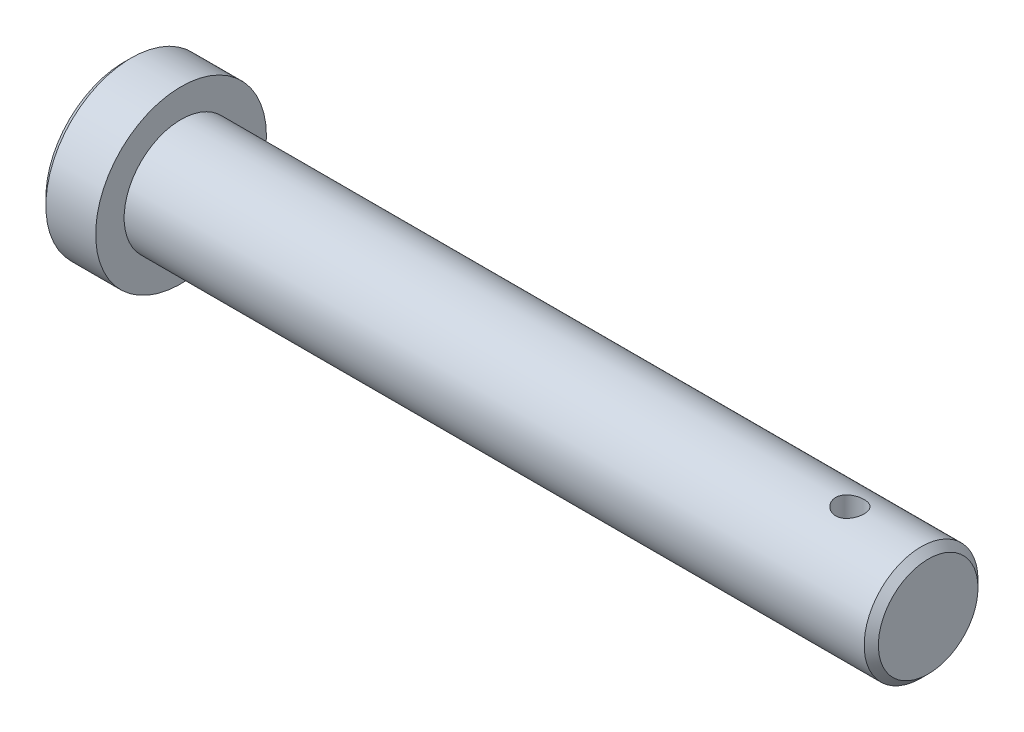
ISO-10303-21;
HEADER;
FILE_DESCRIPTION(('STEP AP214'),'2;1');
FILE_NAME('part.step','',(''),(''),'','','');
FILE_SCHEMA(('AUTOMOTIVE_DESIGN { 1 0 10303 214 1 1 1 1 }'));
ENDSEC;
DATA;
#1=APPLICATION_CONTEXT('core data for automotive mechanical design processes');
#2=APPLICATION_PROTOCOL_DEFINITION('international standard','automotive_design',2000,#1);
#3=PRODUCT_CONTEXT('',#1,'mechanical');
#4=PRODUCT('Part','Part','',(#3));
#5=PRODUCT_RELATED_PRODUCT_CATEGORY('part','',(#4));
#6=PRODUCT_DEFINITION_FORMATION('','',#4);
#7=PRODUCT_DEFINITION_CONTEXT('part definition',#1,'design');
#8=PRODUCT_DEFINITION('design','',#6,#7);
#9=PRODUCT_DEFINITION_SHAPE('','',#8);
#10=(LENGTH_UNIT() NAMED_UNIT(*) SI_UNIT(.MILLI.,.METRE.));
#11=(NAMED_UNIT(*) PLANE_ANGLE_UNIT() SI_UNIT($,.RADIAN.));
#12=(NAMED_UNIT(*) SI_UNIT($,.STERADIAN.) SOLID_ANGLE_UNIT());
#13=UNCERTAINTY_MEASURE_WITH_UNIT(LENGTH_MEASURE(1.E-05),#10,'distance_accuracy_value','');
#14=(GEOMETRIC_REPRESENTATION_CONTEXT(3) GLOBAL_UNCERTAINTY_ASSIGNED_CONTEXT((#13)) GLOBAL_UNIT_ASSIGNED_CONTEXT((#10,
#11,#12)) REPRESENTATION_CONTEXT('',''));
#15=CARTESIAN_POINT('',(0.,0.,0.));
#16=DIRECTION('',(0.,0.,1.));
#17=DIRECTION('',(1.,0.,0.));
#18=AXIS2_PLACEMENT_3D('',#15,#16,#17);
#19=CARTESIAN_POINT('',(8.,0.,0.));
#20=DIRECTION('',(-1.,0.,0.));
#21=DIRECTION('',(0.,0.,1.));
#22=AXIS2_PLACEMENT_3D('',#19,#20,#21);
#23=CYLINDRICAL_SURFACE('',#22,12.);
#24=CARTESIAN_POINT('',(1.,0.,0.));
#25=DIRECTION('',(1.,0.,0.));
#26=DIRECTION('',(0.,0.,-1.));
#27=AXIS2_PLACEMENT_3D('',#24,#25,#26);
#28=CIRCLE('',#27,12.);
#29=CARTESIAN_POINT('',(1.,0.,-12.));
#30=VERTEX_POINT('',#29);
#31=EDGE_CURVE('E111',#30,#30,#28,.T.);
#32=ORIENTED_EDGE('',*,*,#31,.T.);
#33=EDGE_LOOP('',(#32));
#34=FACE_BOUND('',#33,.T.);
#35=CARTESIAN_POINT('',(8.,0.,0.));
#36=DIRECTION('',(1.,0.,0.));
#37=DIRECTION('',(0.,0.,-1.));
#38=AXIS2_PLACEMENT_3D('',#35,#36,#37);
#39=CIRCLE('',#38,12.);
#40=CARTESIAN_POINT('',(8.,0.,-12.));
#41=VERTEX_POINT('',#40);
#42=EDGE_CURVE('E112',#41,#41,#39,.T.);
#43=ORIENTED_EDGE('',*,*,#42,.F.);
#44=EDGE_LOOP('',(#43));
#45=FACE_BOUND('',#44,.T.);
#46=ADVANCED_FACE('F39',(#34,#45),#23,.T.);
#47=CARTESIAN_POINT('',(8.,0.,0.));
#48=DIRECTION('',(1.,0.,0.));
#49=DIRECTION('',(0.,0.,-1.));
#50=AXIS2_PLACEMENT_3D('',#47,#48,#49);
#51=PLANE('',#50);
#52=CARTESIAN_POINT('',(8.,0.,0.));
#53=DIRECTION('',(1.,0.,0.));
#54=DIRECTION('',(0.,0.,-1.));
#55=AXIS2_PLACEMENT_3D('',#52,#53,#54);
#56=CIRCLE('',#55,8.);
#57=CARTESIAN_POINT('',(8.,0.,-8.));
#58=VERTEX_POINT('',#57);
#59=EDGE_CURVE('E58',#58,#58,#56,.T.);
#60=ORIENTED_EDGE('',*,*,#59,.F.);
#61=EDGE_LOOP('',(#60));
#62=FACE_BOUND('',#61,.T.);
#63=ORIENTED_EDGE('',*,*,#42,.T.);
#64=EDGE_LOOP('',(#63));
#65=FACE_BOUND('',#64,.T.);
#66=ADVANCED_FACE('F87',(#62,#65),#51,.T.);
#67=CARTESIAN_POINT('',(0.,0.,0.));
#68=DIRECTION('',(1.,0.,0.));
#69=DIRECTION('',(0.,0.,-1.));
#70=AXIS2_PLACEMENT_3D('',#67,#68,#69);
#71=PLANE('',#70);
#72=CARTESIAN_POINT('',(0.,0.,0.));
#73=DIRECTION('',(1.,0.,0.));
#74=DIRECTION('',(0.,0.,-1.));
#75=AXIS2_PLACEMENT_3D('',#72,#73,#74);
#76=CIRCLE('',#75,11.);
#77=CARTESIAN_POINT('',(0.,0.,-11.));
#78=VERTEX_POINT('',#77);
#79=EDGE_CURVE('E109',#78,#78,#76,.F.);
#80=ORIENTED_EDGE('',*,*,#79,.T.);
#81=EDGE_LOOP('',(#80));
#82=FACE_BOUND('',#81,.T.);
#83=ADVANCED_FACE('F93',(#82),#71,.F.);
#84=CARTESIAN_POINT('',(1.,0.,0.));
#85=DIRECTION('',(1.,0.,0.));
#86=DIRECTION('',(0.,0.,-1.));
#87=AXIS2_PLACEMENT_3D('',#84,#85,#86);
#88=CONICAL_SURFACE('',#87,12.,0.78539816339745);
#89=ORIENTED_EDGE('',*,*,#79,.F.);
#90=EDGE_LOOP('',(#89));
#91=FACE_BOUND('',#90,.T.);
#92=ORIENTED_EDGE('',*,*,#31,.F.);
#93=EDGE_LOOP('',(#92));
#94=FACE_BOUND('',#93,.T.);
#95=ADVANCED_FACE('F84',(#91,#94),#88,.T.);
#96=CARTESIAN_POINT('',(113.,0.,0.));
#97=DIRECTION('',(-1.,0.,0.));
#98=DIRECTION('',(0.,0.,1.));
#99=AXIS2_PLACEMENT_3D('',#96,#97,#98);
#100=CYLINDRICAL_SURFACE('',#99,8.);
#101=CARTESIAN_POINT('',(102.,-7.74596669241483,2.));
#102=CARTESIAN_POINT('',(102.110440600741,-7.74596880070288,1.99999686287445));
#103=CARTESIAN_POINT('',(102.220915918943,-7.74835444811678,1.99082099639812));
#104=CARTESIAN_POINT('',(102.438694062539,-7.75761489594051,1.95441850037103));
#105=CARTESIAN_POINT('',(102.545995003575,-7.76449230897304,1.92718136539368));
#106=CARTESIAN_POINT('',(102.75424283055,-7.7819097967692,1.85559295970563));
#107=CARTESIAN_POINT('',(102.855197724309,-7.79244514152366,1.81126378228359));
#108=CARTESIAN_POINT('',(103.048248682032,-7.81598553623007,1.70681691300911));
#109=CARTESIAN_POINT('',(103.140344369664,-7.82899069102791,1.64669855084855));
#110=CARTESIAN_POINT('',(103.31508931621,-7.856325730845,1.51096674184951));
#111=CARTESIAN_POINT('',(103.39751488028,-7.87067678098427,1.43506951016325));
#112=CARTESIAN_POINT('',(103.548609115488,-7.89890300412235,1.27054565128054));
#113=CARTESIAN_POINT('',(103.617276500497,-7.91277813253111,1.18191783534426));
#114=CARTESIAN_POINT('',(103.739820374105,-7.93872332416466,0.992916160863172));
#115=CARTESIAN_POINT('',(103.793477110529,-7.95076549920474,0.892395660956105));
#116=CARTESIAN_POINT('',(103.883047715322,-7.97144649540787,0.683410547434216));
#117=CARTESIAN_POINT('',(103.918964201532,-7.98008581867475,0.574947108633554));
#118=CARTESIAN_POINT('',(103.971318267663,-7.99283807078544,0.355487007003329));
#119=CARTESIAN_POINT('',(103.988135715461,-7.99703915075451,0.244586175639181));
#120=CARTESIAN_POINT('',(104.00300670342,-8.00074875285838,0.0214630554102188));
#121=CARTESIAN_POINT('',(104.001063017768,-8.00025796877363,-0.0907590356304507));
#122=CARTESIAN_POINT('',(103.9787401198,-7.99470475962828,-0.310704494344769));
#123=CARTESIAN_POINT('',(103.958770939957,-7.98974401872699,-0.418472431202127));
#124=CARTESIAN_POINT('',(103.901622983961,-7.97592669219883,-0.629076494827365));
#125=CARTESIAN_POINT('',(103.864443291698,-7.96706989918753,-0.73191235874087));
#126=CARTESIAN_POINT('',(103.77359794345,-7.94630007760716,-0.930813407003608));
#127=CARTESIAN_POINT('',(103.719786364271,-7.93436015756043,-1.026809019533));
#128=CARTESIAN_POINT('',(103.597315456707,-7.90871923047719,-1.20855124468097));
#129=CARTESIAN_POINT('',(103.528653545151,-7.89501791721992,-1.29429607017101));
#130=CARTESIAN_POINT('',(103.376233006414,-7.86690971015616,-1.4555480701699));
#131=CARTESIAN_POINT('',(103.292116086122,-7.85249375620734,-1.53071535815039));
#132=CARTESIAN_POINT('',(103.112320021168,-7.82492034813365,-1.66595275192603));
#133=CARTESIAN_POINT('',(103.016640336407,-7.81176295284777,-1.72602215209203));
#134=CARTESIAN_POINT('',(102.815767972681,-7.78816397465319,-1.82957625804519));
#135=CARTESIAN_POINT('',(102.710531415749,-7.77773586980577,-1.87297913394098));
#136=CARTESIAN_POINT('',(102.493931625539,-7.76094912111966,-1.94137124127268));
#137=CARTESIAN_POINT('',(102.382569708813,-7.75458960648175,-1.96636441310582));
#138=CARTESIAN_POINT('',(102.160032398781,-7.74684284831313,-1.99666371093214));
#139=CARTESIAN_POINT('',(102.048929765336,-7.74532871274919,-2.0024723791357));
#140=CARTESIAN_POINT('',(101.827342450737,-7.74709874784831,-1.99561359241243));
#141=CARTESIAN_POINT('',(101.716857713639,-7.75038247681013,-1.98294783827904));
#142=CARTESIAN_POINT('',(101.501508588036,-7.76125665563648,-1.93994037115013));
#143=CARTESIAN_POINT('',(101.396581818743,-7.768775761875,-1.90989125462539));
#144=CARTESIAN_POINT('',(101.193254833719,-7.7872057461677,-1.83329446533649));
#145=CARTESIAN_POINT('',(101.094855392756,-7.79811702598891,-1.78674483817003));
#146=CARTESIAN_POINT('',(100.905246977706,-7.8223690967461,-1.67741653434924));
#147=CARTESIAN_POINT('',(100.814216927966,-7.83575334885314,-1.61433740306849));
#148=CARTESIAN_POINT('',(100.643849309759,-7.86333666457373,-1.4741205858689));
#149=CARTESIAN_POINT('',(100.56451366668,-7.87753586182776,-1.39698058961087));
#150=CARTESIAN_POINT('',(100.417751165943,-7.90557922425285,-1.22852544196944));
#151=CARTESIAN_POINT('',(100.350671949961,-7.91940561649468,-1.13690390506318));
#152=CARTESIAN_POINT('',(100.232851306439,-7.94477773290987,-0.943405365389353));
#153=CARTESIAN_POINT('',(100.182109026713,-7.95632357603169,-0.841528897915187));
#154=CARTESIAN_POINT('',(100.098843172378,-7.9757609259065,-0.631116403462189));
#155=CARTESIAN_POINT('',(100.066188572497,-7.98367864017925,-0.522634762055773));
#156=CARTESIAN_POINT('',(100.019631732313,-7.99508234716634,-0.301499520637622));
#157=CARTESIAN_POINT('',(100.005725873009,-7.99856919514738,-0.188846730082488));
#158=CARTESIAN_POINT('',(99.9972648208489,-8.00068338817612,0.0341670528866387));
#159=CARTESIAN_POINT('',(100.002196581809,-7.99943957759977,0.144507653932035));
#160=CARTESIAN_POINT('',(100.030095654589,-7.99251792914887,0.362734992829493));
#161=CARTESIAN_POINT('',(100.053062430026,-7.98684022314338,0.470621803561851));
#162=CARTESIAN_POINT('',(100.116104439542,-7.97170865707778,0.680342071289543));
#163=CARTESIAN_POINT('',(100.156086906629,-7.96227529004785,0.782204989161721));
#164=CARTESIAN_POINT('',(100.251941158039,-7.94062577827316,0.977834106083244));
#165=CARTESIAN_POINT('',(100.307814945341,-7.92840928277515,1.07159928253126));
#166=CARTESIAN_POINT('',(100.435430467992,-7.90214499360574,1.2508038568466));
#167=CARTESIAN_POINT('',(100.507520285808,-7.88806033883329,1.33598997659666));
#168=CARTESIAN_POINT('',(100.664845703955,-7.8598129811438,1.493230040547));
#169=CARTESIAN_POINT('',(100.750084632222,-7.84565025934605,1.56528065015317));
#170=CARTESIAN_POINT('',(100.933202828379,-7.81854951691005,1.69552405294366));
#171=CARTESIAN_POINT('',(101.03128824673,-7.80563927346578,1.75343323883275));
#172=CARTESIAN_POINT('',(101.23611097975,-7.78287910989656,1.85185379317093));
#173=CARTESIAN_POINT('',(101.342841932188,-7.77302696466428,1.8923778195043));
#174=CARTESIAN_POINT('',(101.54115402367,-7.75903817501475,1.948845057142));
#175=CARTESIAN_POINT('',(101.631786328772,-7.75417326006998,1.96798634119375));
#176=CARTESIAN_POINT('',(101.814937737995,-7.7476367716524,1.99356458514353));
#177=CARTESIAN_POINT('',(101.907456680489,-7.74596492578216,2.0000026287435));
#178=CARTESIAN_POINT('',(102.,-7.74596669241483,2.));
#179=B_SPLINE_CURVE_WITH_KNOTS('',3,(#101,#102,#103,#104,#105,#106,#107,#108,#109,#110,#111,
#112,#113,#114,#115,#116,#117,#118,#119,#120,#121,#122,#123,#124,#125,#126,#127,#128,#129,#130,
#131,#132,#133,#134,#135,#136,#137,#138,#139,#140,#141,#142,#143,#144,#145,#146,#147,#148,#149,
#150,#151,#152,#153,#154,#155,#156,#157,#158,#159,#160,#161,#162,#163,#164,#165,#166,#167,#168,
#169,#170,#171,#172,#173,#174,#175,#176,#177,#178),.UNSPECIFIED.,.T.,.F.,(4,2,2,2,2,2,2,2,2,2,2,
2,2,2,2,2,2,2,2,2,2,2,2,2,2,2,2,2,2,2,2,2,2,2,2,2,2,2,4),(0.,0.330981953388902,
0.662156593142927,0.992904581732803,1.32366661404381,1.66099163354378,1.99834817183891,
2.34041197118335,2.68242527877673,3.01751000796276,3.35254518932815,3.68014610151156,
4.00776445379828,4.33834299403555,4.66897908375129,5.00856373257526,5.3481642495984,
5.6894114560672,6.03058560103637,6.36274859809372,6.69488101747039,7.02157924007365,
7.34831617137133,7.68146276687326,8.01466415108035,8.35620264772253,8.6977233257564,
9.03673658245541,9.37568439127228,9.70546756901963,10.0352409390158,10.3632390124777,
10.6912784459046,11.0271767726565,11.363160252524,11.7054118182895,12.0474137709605,
12.3247826174462,12.6021278008237),.UNSPECIFIED.);
#180=CARTESIAN_POINT('',(102.,-7.74596669241483,2.));
#181=VERTEX_POINT('',#180);
#182=EDGE_CURVE('E44',#181,#181,#179,.T.);
#183=ORIENTED_EDGE('',*,*,#182,.T.);
#184=EDGE_LOOP('',(#183));
#185=FACE_BOUND('',#184,.T.);
#186=CARTESIAN_POINT('',(102.,7.74596669241483,2.));
#187=CARTESIAN_POINT('',(101.889559399259,7.74596880070288,1.99999686287445));
#188=CARTESIAN_POINT('',(101.779084081057,7.74835444811678,1.99082099639812));
#189=CARTESIAN_POINT('',(101.561305937461,7.75761489594051,1.95441850037103));
#190=CARTESIAN_POINT('',(101.454004996425,7.76449230897304,1.92718136539368));
#191=CARTESIAN_POINT('',(101.24575716945,7.7819097967692,1.85559295970563));
#192=CARTESIAN_POINT('',(101.144802275691,7.79244514152366,1.81126378228359));
#193=CARTESIAN_POINT('',(100.951751317968,7.81598553623007,1.70681691300911));
#194=CARTESIAN_POINT('',(100.859655630336,7.82899069102791,1.64669855084855));
#195=CARTESIAN_POINT('',(100.68491068379,7.856325730845,1.51096674184951));
#196=CARTESIAN_POINT('',(100.60248511972,7.87067678098427,1.43506951016325));
#197=CARTESIAN_POINT('',(100.451390884512,7.89890300412235,1.27054565128054));
#198=CARTESIAN_POINT('',(100.382723499503,7.91277813253111,1.18191783534426));
#199=CARTESIAN_POINT('',(100.260179625895,7.93872332416466,0.992916160863172));
#200=CARTESIAN_POINT('',(100.206522889471,7.95076549920474,0.892395660956105));
#201=CARTESIAN_POINT('',(100.116952284678,7.97144649540787,0.683410547434216));
#202=CARTESIAN_POINT('',(100.081035798468,7.98008581867475,0.574947108633554));
#203=CARTESIAN_POINT('',(100.028681732337,7.99283807078544,0.355487007003329));
#204=CARTESIAN_POINT('',(100.011864284539,7.99703915075451,0.244586175639181));
#205=CARTESIAN_POINT('',(99.9969932965796,8.00074875285838,0.0214630554102188));
#206=CARTESIAN_POINT('',(99.9989369822323,8.00025796877363,-0.0907590356304507));
#207=CARTESIAN_POINT('',(100.0212598802,7.99470475962828,-0.310704494344769));
#208=CARTESIAN_POINT('',(100.041229060043,7.98974401872699,-0.418472431202127));
#209=CARTESIAN_POINT('',(100.098377016039,7.97592669219883,-0.629076494827365));
#210=CARTESIAN_POINT('',(100.135556708302,7.96706989918753,-0.73191235874087));
#211=CARTESIAN_POINT('',(100.22640205655,7.94630007760716,-0.930813407003608));
#212=CARTESIAN_POINT('',(100.280213635729,7.93436015756043,-1.026809019533));
#213=CARTESIAN_POINT('',(100.402684543293,7.90871923047719,-1.20855124468097));
#214=CARTESIAN_POINT('',(100.471346454849,7.89501791721992,-1.29429607017101));
#215=CARTESIAN_POINT('',(100.623766993586,7.86690971015616,-1.4555480701699));
#216=CARTESIAN_POINT('',(100.707883913878,7.85249375620734,-1.53071535815039));
#217=CARTESIAN_POINT('',(100.887679978832,7.82492034813365,-1.66595275192603));
#218=CARTESIAN_POINT('',(100.983359663593,7.81176295284777,-1.72602215209203));
#219=CARTESIAN_POINT('',(101.184232027319,7.78816397465319,-1.82957625804519));
#220=CARTESIAN_POINT('',(101.289468584251,7.77773586980577,-1.87297913394098));
#221=CARTESIAN_POINT('',(101.506068374461,7.76094912111966,-1.94137124127268));
#222=CARTESIAN_POINT('',(101.617430291186,7.75458960648175,-1.96636441310582));
#223=CARTESIAN_POINT('',(101.839967601218,7.74684284831313,-1.99666371093214));
#224=CARTESIAN_POINT('',(101.951070234664,7.74532871274919,-2.0024723791357));
#225=CARTESIAN_POINT('',(102.172657549263,7.74709874784831,-1.99561359241243));
#226=CARTESIAN_POINT('',(102.283142286361,7.75038247681013,-1.98294783827904));
#227=CARTESIAN_POINT('',(102.498491411964,7.76125665563648,-1.93994037115013));
#228=CARTESIAN_POINT('',(102.603418181257,7.768775761875,-1.9098912546254));
#229=CARTESIAN_POINT('',(102.806745166281,7.7872057461677,-1.8332944653365));
#230=CARTESIAN_POINT('',(102.905144607244,7.79811702598891,-1.78674483817003));
#231=CARTESIAN_POINT('',(103.094753022294,7.8223690967461,-1.67741653434924));
#232=CARTESIAN_POINT('',(103.185783072034,7.83575334885313,-1.6143374030685));
#233=CARTESIAN_POINT('',(103.356150690241,7.86333666457373,-1.4741205858689));
#234=CARTESIAN_POINT('',(103.43548633332,7.87753586182776,-1.39698058961087));
#235=CARTESIAN_POINT('',(103.582248834057,7.90557922425285,-1.22852544196944));
#236=CARTESIAN_POINT('',(103.649328050039,7.91940561649468,-1.13690390506318));
#237=CARTESIAN_POINT('',(103.767148693561,7.94477773290987,-0.943405365389353));
#238=CARTESIAN_POINT('',(103.817890973287,7.95632357603169,-0.841528897915187));
#239=CARTESIAN_POINT('',(103.901156827622,7.9757609259065,-0.631116403462189));
#240=CARTESIAN_POINT('',(103.933811427503,7.98367864017925,-0.522634762055773));
#241=CARTESIAN_POINT('',(103.980368267687,7.99508234716634,-0.301499520637622));
#242=CARTESIAN_POINT('',(103.994274126991,7.99856919514738,-0.188846730082488));
#243=CARTESIAN_POINT('',(104.002735179151,8.00068338817612,0.0341670528866387));
#244=CARTESIAN_POINT('',(103.997803418191,7.99943957759977,0.144507653932035));
#245=CARTESIAN_POINT('',(103.969904345411,7.99251792914887,0.362734992829493));
#246=CARTESIAN_POINT('',(103.946937569974,7.98684022314338,0.470621803561851));
#247=CARTESIAN_POINT('',(103.883895560458,7.97170865707778,0.680342071289542));
#248=CARTESIAN_POINT('',(103.843913093371,7.96227529004785,0.782204989161717));
#249=CARTESIAN_POINT('',(103.748058841961,7.94062577827316,0.977834106083241));
#250=CARTESIAN_POINT('',(103.692185054659,7.92840928277515,1.07159928253126));
#251=CARTESIAN_POINT('',(103.564569532008,7.90214499360574,1.2508038568466));
#252=CARTESIAN_POINT('',(103.492479714192,7.88806033883329,1.33598997659666));
#253=CARTESIAN_POINT('',(103.335154296045,7.8598129811438,1.493230040547));
#254=CARTESIAN_POINT('',(103.249915367778,7.84565025934605,1.56528065015317));
#255=CARTESIAN_POINT('',(103.066797171621,7.81854951691005,1.69552405294366));
#256=CARTESIAN_POINT('',(102.968711753269,7.80563927346578,1.75343323883275));
#257=CARTESIAN_POINT('',(102.76388902025,7.78287910989656,1.85185379317093));
#258=CARTESIAN_POINT('',(102.657158067812,7.77302696466428,1.8923778195043));
#259=CARTESIAN_POINT('',(102.45884597633,7.75903817501475,1.948845057142));
#260=CARTESIAN_POINT('',(102.368213671228,7.75417326006998,1.96798634119375));
#261=CARTESIAN_POINT('',(102.185062262005,7.7476367716524,1.99356458514353));
#262=CARTESIAN_POINT('',(102.092543319511,7.74596492578216,2.0000026287435));
#263=CARTESIAN_POINT('',(102.,7.74596669241483,2.));
#264=B_SPLINE_CURVE_WITH_KNOTS('',3,(#186,#187,#188,#189,#190,#191,#192,#193,#194,#195,#196,
#197,#198,#199,#200,#201,#202,#203,#204,#205,#206,#207,#208,#209,#210,#211,#212,#213,#214,#215,
#216,#217,#218,#219,#220,#221,#222,#223,#224,#225,#226,#227,#228,#229,#230,#231,#232,#233,#234,
#235,#236,#237,#238,#239,#240,#241,#242,#243,#244,#245,#246,#247,#248,#249,#250,#251,#252,#253,
#254,#255,#256,#257,#258,#259,#260,#261,#262,#263),.UNSPECIFIED.,.T.,.F.,(4,2,2,2,2,2,2,2,2,2,2,
2,2,2,2,2,2,2,2,2,2,2,2,2,2,2,2,2,2,2,2,2,2,2,2,2,2,2,4),(0.,0.330981953388917,
0.662156593142927,0.992904581732803,1.32366661404381,1.66099163354378,1.99834817183891,
2.34041197118335,2.68242527877673,3.01751000796276,3.35254518932815,3.68014610151156,
4.00776445379828,4.33834299403555,4.66897908375129,5.00856373257526,5.3481642495984,
5.6894114560672,6.03058560103637,6.36274859809372,6.69488101747039,7.02157924007363,
7.34831617137133,7.68146276687325,8.01466415108035,8.35620264772253,8.6977233257564,
9.03673658245541,9.37568439127228,9.70546756901963,10.0352409390158,10.3632390124777,
10.6912784459046,11.0271767726565,11.363160252524,11.7054118182895,12.0474137709605,
12.3247826174462,12.6021278008237),.UNSPECIFIED.);
#265=CARTESIAN_POINT('',(102.,7.74596669241483,2.));
#266=VERTEX_POINT('',#265);
#267=EDGE_CURVE('E61',#266,#266,#264,.T.);
#268=ORIENTED_EDGE('',*,*,#267,.T.);
#269=EDGE_LOOP('',(#268));
#270=FACE_BOUND('',#269,.T.);
#271=CARTESIAN_POINT('',(112.,0.,0.));
#272=DIRECTION('',(1.,0.,0.));
#273=DIRECTION('',(0.,0.,-1.));
#274=AXIS2_PLACEMENT_3D('',#271,#272,#273);
#275=CIRCLE('',#274,8.);
#276=CARTESIAN_POINT('',(112.,0.,-8.));
#277=VERTEX_POINT('',#276);
#278=EDGE_CURVE('E10',#277,#277,#275,.F.);
#279=ORIENTED_EDGE('',*,*,#278,.T.);
#280=EDGE_LOOP('',(#279));
#281=FACE_BOUND('',#280,.T.);
#282=ORIENTED_EDGE('',*,*,#59,.T.);
#283=EDGE_LOOP('',(#282));
#284=FACE_BOUND('',#283,.T.);
#285=ADVANCED_FACE('F66',(#185,#270,#281,#284),#100,.T.);
#286=CARTESIAN_POINT('',(113.,0.,0.));
#287=DIRECTION('',(1.,0.,0.));
#288=DIRECTION('',(0.,0.,-1.));
#289=AXIS2_PLACEMENT_3D('',#286,#287,#288);
#290=PLANE('',#289);
#291=CARTESIAN_POINT('',(113.,0.,0.));
#292=DIRECTION('',(1.,0.,0.));
#293=DIRECTION('',(0.,0.,-1.));
#294=AXIS2_PLACEMENT_3D('',#291,#292,#293);
#295=CIRCLE('',#294,7.00000000000001);
#296=CARTESIAN_POINT('',(113.,0.,-7.00000000000001));
#297=VERTEX_POINT('',#296);
#298=EDGE_CURVE('E53',#297,#297,#295,.T.);
#299=ORIENTED_EDGE('',*,*,#298,.T.);
#300=EDGE_LOOP('',(#299));
#301=FACE_BOUND('',#300,.T.);
#302=ADVANCED_FACE('F74',(#301),#290,.T.);
#303=CARTESIAN_POINT('',(113.,0.,0.));
#304=DIRECTION('',(-1.,0.,0.));
#305=DIRECTION('',(0.,0.,1.));
#306=AXIS2_PLACEMENT_3D('',#303,#304,#305);
#307=CONICAL_SURFACE('',#306,7.00000000000001,0.785398163397445);
#308=ORIENTED_EDGE('',*,*,#278,.F.);
#309=EDGE_LOOP('',(#308));
#310=FACE_BOUND('',#309,.T.);
#311=ORIENTED_EDGE('',*,*,#298,.F.);
#312=EDGE_LOOP('',(#311));
#313=FACE_BOUND('',#312,.T.);
#314=ADVANCED_FACE('F42',(#310,#313),#307,.T.);
#315=CARTESIAN_POINT('',(102.,-52.5,0.));
#316=DIRECTION('',(0.,1.,0.));
#317=DIRECTION('',(0.,0.,1.));
#318=AXIS2_PLACEMENT_3D('',#315,#316,#317);
#319=CYLINDRICAL_SURFACE('',#318,2.);
#320=ORIENTED_EDGE('',*,*,#267,.F.);
#321=EDGE_LOOP('',(#320));
#322=FACE_BOUND('',#321,.T.);
#323=ORIENTED_EDGE('',*,*,#182,.F.);
#324=EDGE_LOOP('',(#323));
#325=FACE_BOUND('',#324,.T.);
#326=ADVANCED_FACE('F70',(#322,#325),#319,.F.);
#327=CLOSED_SHELL('',(#46,#66,#83,#95,#285,#302,#314,#326));
#328=MANIFOLD_SOLID_BREP('B2',#327);
#329=ADVANCED_BREP_SHAPE_REPRESENTATION('',(#18,#328),#14);
#330=SHAPE_DEFINITION_REPRESENTATION(#9,#329);
ENDSEC;
END-ISO-10303-21;
